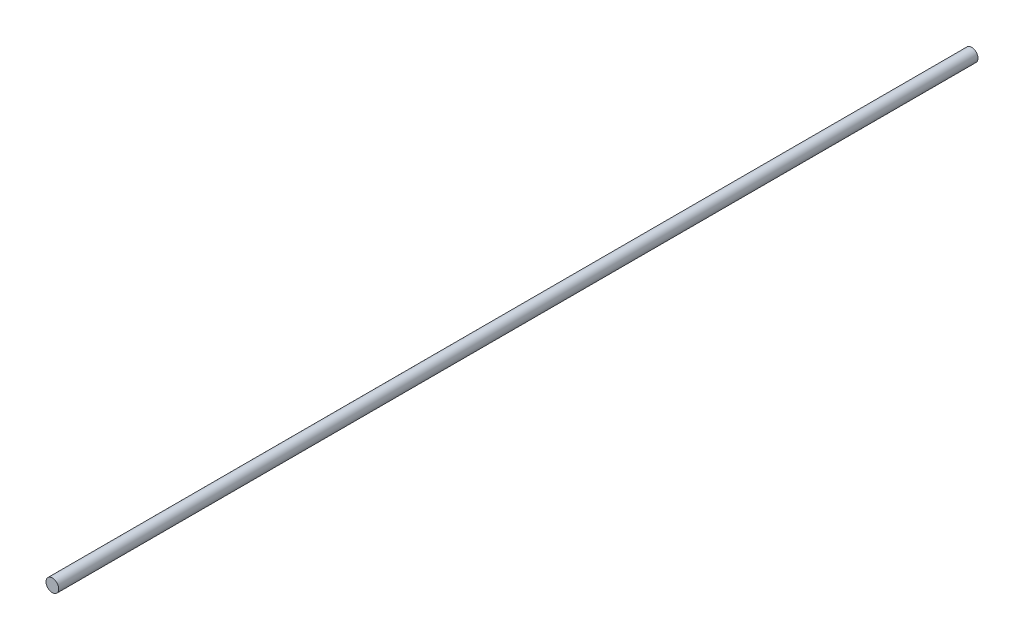
ISO-10303-21;
HEADER;
FILE_DESCRIPTION(('STEP AP214'),'2;1');
FILE_NAME('part.step','',(''),(''),'','','');
FILE_SCHEMA(('AUTOMOTIVE_DESIGN { 1 0 10303 214 1 1 1 1 }'));
ENDSEC;
DATA;
#1=APPLICATION_CONTEXT('core data for automotive mechanical design processes');
#2=APPLICATION_PROTOCOL_DEFINITION('international standard','automotive_design',2000,#1);
#3=PRODUCT_CONTEXT('',#1,'mechanical');
#4=PRODUCT('Part','Part','',(#3));
#5=PRODUCT_RELATED_PRODUCT_CATEGORY('part','',(#4));
#6=PRODUCT_DEFINITION_FORMATION('','',#4);
#7=PRODUCT_DEFINITION_CONTEXT('part definition',#1,'design');
#8=PRODUCT_DEFINITION('design','',#6,#7);
#9=PRODUCT_DEFINITION_SHAPE('','',#8);
#10=(LENGTH_UNIT() NAMED_UNIT(*) SI_UNIT(.MILLI.,.METRE.));
#11=(NAMED_UNIT(*) PLANE_ANGLE_UNIT() SI_UNIT($,.RADIAN.));
#12=(NAMED_UNIT(*) SI_UNIT($,.STERADIAN.) SOLID_ANGLE_UNIT());
#13=UNCERTAINTY_MEASURE_WITH_UNIT(LENGTH_MEASURE(1.E-05),#10,'distance_accuracy_value','');
#14=(GEOMETRIC_REPRESENTATION_CONTEXT(3) GLOBAL_UNCERTAINTY_ASSIGNED_CONTEXT((#13)) GLOBAL_UNIT_ASSIGNED_CONTEXT((#10,
#11,#12)) REPRESENTATION_CONTEXT('',''));
#15=CARTESIAN_POINT('',(0.,0.,0.));
#16=DIRECTION('',(0.,0.,1.));
#17=DIRECTION('',(1.,0.,0.));
#18=AXIS2_PLACEMENT_3D('',#15,#16,#17);
#19=CARTESIAN_POINT('',(0.,0.,228.6));
#20=DIRECTION('',(0.,0.,-1.));
#21=DIRECTION('',(-1.,0.,0.));
#22=AXIS2_PLACEMENT_3D('',#19,#20,#21);
#23=CYLINDRICAL_SURFACE('',#22,3.175);
#24=CARTESIAN_POINT('',(0.,0.,228.6));
#25=DIRECTION('',(0.,0.,1.));
#26=DIRECTION('',(1.,0.,0.));
#27=AXIS2_PLACEMENT_3D('',#24,#25,#26);
#28=CIRCLE('',#27,3.175);
#29=CARTESIAN_POINT('',(3.175,0.,228.6));
#30=VERTEX_POINT('',#29);
#31=EDGE_CURVE('E10',#30,#30,#28,.T.);
#32=ORIENTED_EDGE('',*,*,#31,.F.);
#33=EDGE_LOOP('',(#32));
#34=FACE_BOUND('',#33,.T.);
#35=CARTESIAN_POINT('',(0.,0.,-228.6));
#36=DIRECTION('',(0.,0.,1.));
#37=DIRECTION('',(1.,0.,0.));
#38=AXIS2_PLACEMENT_3D('',#35,#36,#37);
#39=CIRCLE('',#38,3.175);
#40=CARTESIAN_POINT('',(3.175,0.,-228.6));
#41=VERTEX_POINT('',#40);
#42=EDGE_CURVE('E34',#41,#41,#39,.T.);
#43=ORIENTED_EDGE('',*,*,#42,.T.);
#44=EDGE_LOOP('',(#43));
#45=FACE_BOUND('',#44,.T.);
#46=ADVANCED_FACE('F31',(#34,#45),#23,.T.);
#47=CARTESIAN_POINT('',(0.,0.,228.6));
#48=DIRECTION('',(0.,0.,1.));
#49=DIRECTION('',(1.,0.,0.));
#50=AXIS2_PLACEMENT_3D('',#47,#48,#49);
#51=PLANE('',#50);
#52=ORIENTED_EDGE('',*,*,#31,.T.);
#53=EDGE_LOOP('',(#52));
#54=FACE_BOUND('',#53,.T.);
#55=ADVANCED_FACE('F46',(#54),#51,.T.);
#56=CARTESIAN_POINT('',(0.,0.,-228.6));
#57=DIRECTION('',(0.,0.,1.));
#58=DIRECTION('',(1.,0.,0.));
#59=AXIS2_PLACEMENT_3D('',#56,#57,#58);
#60=PLANE('',#59);
#61=ORIENTED_EDGE('',*,*,#42,.F.);
#62=EDGE_LOOP('',(#61));
#63=FACE_BOUND('',#62,.T.);
#64=ADVANCED_FACE('F44',(#63),#60,.F.);
#65=CLOSED_SHELL('',(#46,#55,#64));
#66=MANIFOLD_SOLID_BREP('B2',#65);
#67=ADVANCED_BREP_SHAPE_REPRESENTATION('',(#18,#66),#14);
#68=SHAPE_DEFINITION_REPRESENTATION(#9,#67);
ENDSEC;
END-ISO-10303-21;
